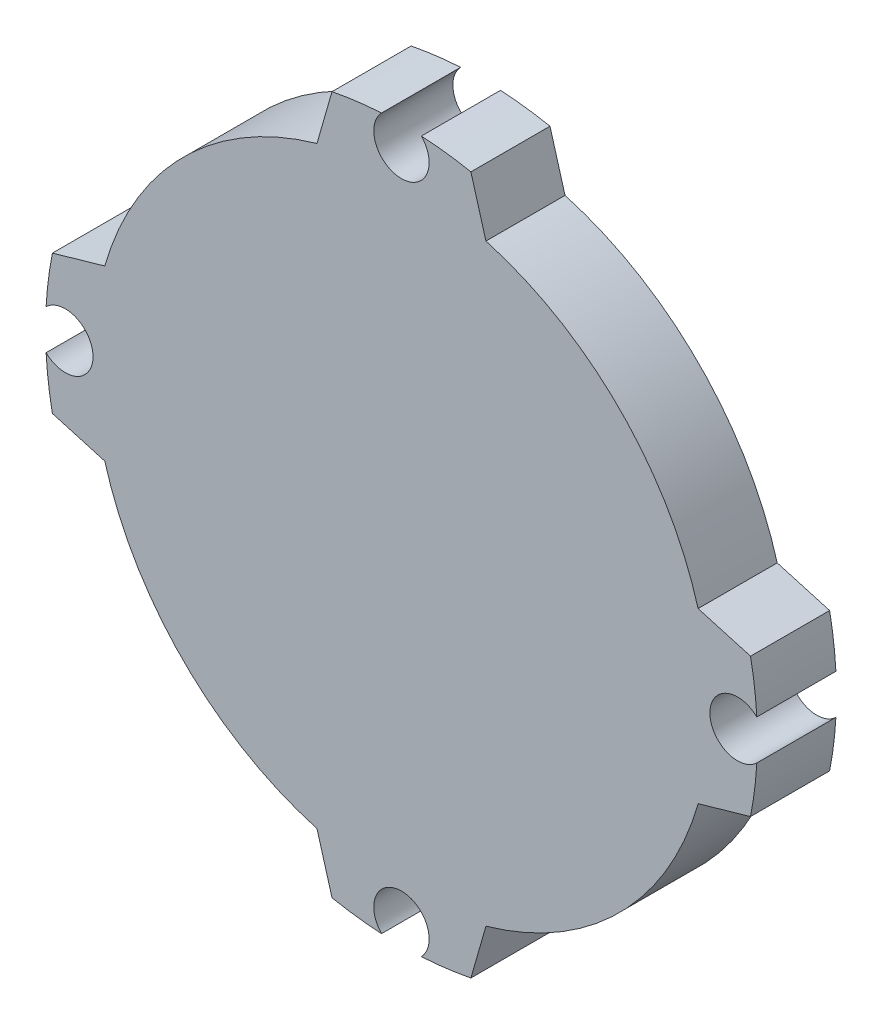
ISO-10303-21;
HEADER;
FILE_DESCRIPTION(('STEP AP214'),'2;1');
FILE_NAME('part.step','',(''),(''),'','','');
FILE_SCHEMA(('AUTOMOTIVE_DESIGN { 1 0 10303 214 1 1 1 1 }'));
ENDSEC;
DATA;
#1=APPLICATION_CONTEXT('core data for automotive mechanical design processes');
#2=APPLICATION_PROTOCOL_DEFINITION('international standard','automotive_design',2000,#1);
#3=PRODUCT_CONTEXT('',#1,'mechanical');
#4=PRODUCT('Part','Part','',(#3));
#5=PRODUCT_RELATED_PRODUCT_CATEGORY('part','',(#4));
#6=PRODUCT_DEFINITION_FORMATION('','',#4);
#7=PRODUCT_DEFINITION_CONTEXT('part definition',#1,'design');
#8=PRODUCT_DEFINITION('design','',#6,#7);
#9=PRODUCT_DEFINITION_SHAPE('','',#8);
#10=(LENGTH_UNIT() NAMED_UNIT(*) SI_UNIT(.MILLI.,.METRE.));
#11=(NAMED_UNIT(*) PLANE_ANGLE_UNIT() SI_UNIT($,.RADIAN.));
#12=(NAMED_UNIT(*) SI_UNIT($,.STERADIAN.) SOLID_ANGLE_UNIT());
#13=UNCERTAINTY_MEASURE_WITH_UNIT(LENGTH_MEASURE(1.E-05),#10,'distance_accuracy_value','');
#14=(GEOMETRIC_REPRESENTATION_CONTEXT(3) GLOBAL_UNCERTAINTY_ASSIGNED_CONTEXT((#13)) GLOBAL_UNIT_ASSIGNED_CONTEXT((#10,
#11,#12)) REPRESENTATION_CONTEXT('',''));
#15=CARTESIAN_POINT('',(0.,0.,0.));
#16=DIRECTION('',(0.,0.,1.));
#17=DIRECTION('',(1.,0.,0.));
#18=AXIS2_PLACEMENT_3D('',#15,#16,#17);
#19=CARTESIAN_POINT('',(8.60270960058673,31.4947345789204,4.));
#20=DIRECTION('',(0.,0.,-1.));
#21=DIRECTION('',(-1.,0.,0.));
#22=AXIS2_PLACEMENT_3D('',#19,#20,#21);
#23=CYLINDRICAL_SURFACE('',#22,1.40000000000075);
#24=CARTESIAN_POINT('',(8.60270960058673,31.4947345789204,0.));
#25=DIRECTION('',(0.,0.,1.));
#26=DIRECTION('',(1.,0.,0.));
#27=AXIS2_PLACEMENT_3D('',#24,#25,#26);
#28=CIRCLE('',#27,1.40000000000075);
#29=CARTESIAN_POINT('',(9.57447430646903,32.5025407886669,0.));
#30=VERTEX_POINT('',#29);
#31=CARTESIAN_POINT('',(9.57447430646899,30.4869283691739,0.));
#32=VERTEX_POINT('',#31);
#33=EDGE_CURVE('E227',#30,#32,#28,.T.);
#34=ORIENTED_EDGE('',*,*,#33,.F.);
#35=DIRECTION('',(0.,0.,-1.));
#36=VECTOR('',#35,1.);
#37=CARTESIAN_POINT('',(9.57447430646903,32.5025407886669,4.));
#38=LINE('',#37,#36);
#39=CARTESIAN_POINT('',(9.57447430646903,32.5025407886669,4.));
#40=VERTEX_POINT('',#39);
#41=EDGE_CURVE('E11',#40,#30,#38,.T.);
#42=ORIENTED_EDGE('',*,*,#41,.F.);
#43=CARTESIAN_POINT('',(8.60270960058673,31.4947345789204,4.));
#44=DIRECTION('',(0.,0.,1.));
#45=DIRECTION('',(1.,0.,0.));
#46=AXIS2_PLACEMENT_3D('',#43,#44,#45);
#47=CIRCLE('',#46,1.40000000000075);
#48=CARTESIAN_POINT('',(9.57447430646899,30.4869283691739,4.));
#49=VERTEX_POINT('',#48);
#50=EDGE_CURVE('E393',#40,#49,#47,.T.);
#51=ORIENTED_EDGE('',*,*,#50,.T.);
#52=DIRECTION('',(0.,0.,-1.));
#53=VECTOR('',#52,1.);
#54=CARTESIAN_POINT('',(9.57447430646899,30.4869283691739,4.));
#55=LINE('',#54,#53);
#56=EDGE_CURVE('E133',#49,#32,#55,.T.);
#57=ORIENTED_EDGE('',*,*,#56,.T.);
#58=EDGE_LOOP('',(#34,#42,#51,#57));
#59=FACE_BOUND('',#58,.T.);
#60=ADVANCED_FACE('F35',(#59),#23,.F.);
#61=CARTESIAN_POINT('',(-8.39729039941328,31.4947345789208,4.));
#62=DIRECTION('',(0.,0.,-1.));
#63=DIRECTION('',(-1.,0.,0.));
#64=AXIS2_PLACEMENT_3D('',#61,#62,#63);
#65=CYLINDRICAL_SURFACE('',#64,18.);
#66=CARTESIAN_POINT('',(-8.39729039941328,31.4947345789208,0.));
#67=DIRECTION('',(0.,0.,1.));
#68=DIRECTION('',(1.,0.,0.));
#69=AXIS2_PLACEMENT_3D('',#66,#67,#68);
#70=CIRCLE('',#69,18.);
#71=CARTESIAN_POINT('',(9.25671878014972,35.0069930955886,0.));
#72=VERTEX_POINT('',#71);
#73=EDGE_CURVE('E230',#30,#72,#70,.T.);
#74=ORIENTED_EDGE('',*,*,#73,.T.);
#75=DIRECTION('',(0.,0.,-1.));
#76=VECTOR('',#75,1.);
#77=CARTESIAN_POINT('',(9.25671878014972,35.0069930955886,4.));
#78=LINE('',#77,#76);
#79=CARTESIAN_POINT('',(9.25671878014972,35.0069930955886,4.));
#80=VERTEX_POINT('',#79);
#81=EDGE_CURVE('E43',#80,#72,#78,.T.);
#82=ORIENTED_EDGE('',*,*,#81,.F.);
#83=CARTESIAN_POINT('',(-8.39729039941328,31.4947345789208,4.));
#84=DIRECTION('',(0.,0.,1.));
#85=DIRECTION('',(1.,0.,0.));
#86=AXIS2_PLACEMENT_3D('',#83,#84,#85);
#87=CIRCLE('',#86,18.);
#88=EDGE_CURVE('E224',#40,#80,#87,.T.);
#89=ORIENTED_EDGE('',*,*,#88,.F.);
#90=ORIENTED_EDGE('',*,*,#41,.T.);
#91=EDGE_LOOP('',(#74,#82,#89,#90));
#92=FACE_BOUND('',#91,.T.);
#93=ADVANCED_FACE('F453',(#92),#65,.T.);
#94=CARTESIAN_POINT('',(9.98547614567223,34.7978714167868,4.));
#95=DIRECTION('',(-0.275824877161817,-0.961207905262264,0.));
#96=DIRECTION('',(0.961207905262264,-0.275824877161817,0.));
#97=AXIS2_PLACEMENT_3D('',#94,#95,#96);
#98=PLANE('',#97);
#99=DIRECTION('',(-0.961207905262264,0.275824877161817,0.));
#100=VECTOR('',#99,1.);
#101=CARTESIAN_POINT('',(9.98547614567223,34.7978714167868,0.));
#102=LINE('',#101,#100);
#103=CARTESIAN_POINT('',(6.60613088843301,35.7675965775584,0.));
#104=VERTEX_POINT('',#103);
#105=EDGE_CURVE('E232',#72,#104,#102,.T.);
#106=ORIENTED_EDGE('',*,*,#105,.T.);
#107=DIRECTION('',(0.,0.,-1.));
#108=VECTOR('',#107,1.);
#109=CARTESIAN_POINT('',(6.60613088843301,35.7675965775584,4.));
#110=LINE('',#109,#108);
#111=CARTESIAN_POINT('',(6.60613088843301,35.7675965775584,4.));
#112=VERTEX_POINT('',#111);
#113=EDGE_CURVE('E319',#112,#104,#110,.T.);
#114=ORIENTED_EDGE('',*,*,#113,.F.);
#115=DIRECTION('',(-0.961207905262264,0.275824877161817,0.));
#116=VECTOR('',#115,1.);
#117=CARTESIAN_POINT('',(9.98547614567223,34.7978714167868,4.));
#118=LINE('',#117,#116);
#119=EDGE_CURVE('E328',#80,#112,#118,.T.);
#120=ORIENTED_EDGE('',*,*,#119,.F.);
#121=ORIENTED_EDGE('',*,*,#81,.T.);
#122=EDGE_LOOP('',(#106,#114,#120,#121));
#123=FACE_BOUND('',#122,.T.);
#124=ADVANCED_FACE('F326',(#123),#98,.F.);
#125=CARTESIAN_POINT('',(-8.39729039941328,31.4947345789208,4.));
#126=DIRECTION('',(0.,0.,-1.));
#127=DIRECTION('',(-1.,0.,0.));
#128=AXIS2_PLACEMENT_3D('',#125,#126,#127);
#129=CYLINDRICAL_SURFACE('',#128,15.6);
#130=CARTESIAN_POINT('',(-8.39729039941328,31.4947345789208,0.));
#131=DIRECTION('',(0.,0.,1.));
#132=DIRECTION('',(1.,0.,0.));
#133=AXIS2_PLACEMENT_3D('',#130,#131,#132);
#134=CIRCLE('',#133,15.6);
#135=CARTESIAN_POINT('',(-4.12442840077335,46.4981558667664,0.));
#136=VERTEX_POINT('',#135);
#137=EDGE_CURVE('E236',#104,#136,#134,.T.);
#138=ORIENTED_EDGE('',*,*,#137,.T.);
#139=DIRECTION('',(0.,0.,-1.));
#140=VECTOR('',#139,1.);
#141=CARTESIAN_POINT('',(-4.12442840077335,46.4981558667664,4.));
#142=LINE('',#141,#140);
#143=CARTESIAN_POINT('',(-4.12442840077335,46.4981558667664,4.));
#144=VERTEX_POINT('',#143);
#145=EDGE_CURVE('E317',#144,#136,#142,.T.);
#146=ORIENTED_EDGE('',*,*,#145,.F.);
#147=CARTESIAN_POINT('',(-8.39729039941328,31.4947345789208,4.));
#148=DIRECTION('',(0.,0.,1.));
#149=DIRECTION('',(1.,0.,0.));
#150=AXIS2_PLACEMENT_3D('',#147,#148,#149);
#151=CIRCLE('',#150,15.6);
#152=EDGE_CURVE('E341',#112,#144,#151,.T.);
#153=ORIENTED_EDGE('',*,*,#152,.F.);
#154=ORIENTED_EDGE('',*,*,#113,.T.);
#155=EDGE_LOOP('',(#138,#146,#153,#154));
#156=FACE_BOUND('',#155,.T.);
#157=ADVANCED_FACE('F338',(#156),#129,.T.);
#158=CARTESIAN_POINT('',(8.51718149462446,2.44406077671683,4.));
#159=DIRECTION('',(0.961207905262203,0.275824877162029,0.));
#160=DIRECTION('',(-0.275824877162029,0.961207905262203,0.));
#161=AXIS2_PLACEMENT_3D('',#158,#159,#160);
#162=PLANE('',#161);
#163=DIRECTION('',(0.275824877162029,-0.961207905262203,0.));
#164=VECTOR('',#163,1.);
#165=CARTESIAN_POINT('',(8.51718149462446,2.44406077671683,0.));
#166=LINE('',#165,#164);
#167=CARTESIAN_POINT('',(-4.88503188274386,49.1487437584834,0.));
#168=VERTEX_POINT('',#167);
#169=EDGE_CURVE('E239',#168,#136,#166,.T.);
#170=ORIENTED_EDGE('',*,*,#169,.F.);
#171=DIRECTION('',(0.,0.,-1.));
#172=VECTOR('',#171,1.);
#173=CARTESIAN_POINT('',(-4.88503188274386,49.1487437584834,4.));
#174=LINE('',#173,#172);
#175=CARTESIAN_POINT('',(-4.88503188274386,49.1487437584834,4.));
#176=VERTEX_POINT('',#175);
#177=EDGE_CURVE('E315',#176,#168,#174,.T.);
#178=ORIENTED_EDGE('',*,*,#177,.F.);
#179=DIRECTION('',(0.275824877162029,-0.961207905262203,0.));
#180=VECTOR('',#179,1.);
#181=CARTESIAN_POINT('',(8.51718149462446,2.44406077671683,4.));
#182=LINE('',#181,#180);
#183=EDGE_CURVE('E343',#176,#144,#182,.T.);
#184=ORIENTED_EDGE('',*,*,#183,.T.);
#185=ORIENTED_EDGE('',*,*,#145,.T.);
#186=EDGE_LOOP('',(#170,#178,#184,#185));
#187=FACE_BOUND('',#186,.T.);
#188=ADVANCED_FACE('F465',(#187),#162,.T.);
#189=CARTESIAN_POINT('',(-7.38948418966819,49.4664992848031,0.));
#190=VERTEX_POINT('',#189);
#191=EDGE_CURVE('E234',#168,#190,#70,.T.);
#192=ORIENTED_EDGE('',*,*,#191,.T.);
#193=DIRECTION('',(0.,0.,-1.));
#194=VECTOR('',#193,1.);
#195=CARTESIAN_POINT('',(-7.38948418966819,49.4664992848031,4.));
#196=LINE('',#195,#194);
#197=CARTESIAN_POINT('',(-7.38948418966819,49.4664992848031,4.));
#198=VERTEX_POINT('',#197);
#199=EDGE_CURVE('E313',#198,#190,#196,.T.);
#200=ORIENTED_EDGE('',*,*,#199,.F.);
#201=EDGE_CURVE('E345',#176,#198,#87,.T.);
#202=ORIENTED_EDGE('',*,*,#201,.F.);
#203=ORIENTED_EDGE('',*,*,#177,.T.);
#204=EDGE_LOOP('',(#192,#200,#202,#203));
#205=FACE_BOUND('',#204,.T.);
#206=ADVANCED_FACE('F408',(#205),#65,.T.);
#207=CARTESIAN_POINT('',(-8.39729039941181,48.49473457892,4.));
#208=DIRECTION('',(0.,0.,-1.));
#209=DIRECTION('',(-1.,0.,0.));
#210=AXIS2_PLACEMENT_3D('',#207,#208,#209);
#211=CYLINDRICAL_SURFACE('',#210,1.39999999999925);
#212=CARTESIAN_POINT('',(-8.39729039941181,48.49473457892,0.));
#213=DIRECTION('',(0.,0.,1.));
#214=DIRECTION('',(1.,0.,0.));
#215=AXIS2_PLACEMENT_3D('',#212,#213,#214);
#216=CIRCLE('',#215,1.39999999999925);
#217=CARTESIAN_POINT('',(-9.40509660915526,49.4664992848033,0.));
#218=VERTEX_POINT('',#217);
#219=EDGE_CURVE('E242',#218,#190,#216,.T.);
#220=ORIENTED_EDGE('',*,*,#219,.F.);
#221=DIRECTION('',(0.,0.,-1.));
#222=VECTOR('',#221,1.);
#223=CARTESIAN_POINT('',(-9.40509660915526,49.4664992848033,4.));
#224=LINE('',#223,#222);
#225=CARTESIAN_POINT('',(-9.40509660915526,49.4664992848033,4.));
#226=VERTEX_POINT('',#225);
#227=EDGE_CURVE('E311',#226,#218,#224,.T.);
#228=ORIENTED_EDGE('',*,*,#227,.F.);
#229=CARTESIAN_POINT('',(-8.39729039941181,48.49473457892,4.));
#230=DIRECTION('',(0.,0.,1.));
#231=DIRECTION('',(1.,0.,0.));
#232=AXIS2_PLACEMENT_3D('',#229,#230,#231);
#233=CIRCLE('',#232,1.39999999999925);
#234=EDGE_CURVE('E349',#226,#198,#233,.T.);
#235=ORIENTED_EDGE('',*,*,#234,.T.);
#236=ORIENTED_EDGE('',*,*,#199,.T.);
#237=EDGE_LOOP('',(#220,#228,#235,#236));
#238=FACE_BOUND('',#237,.T.);
#239=ADVANCED_FACE('F412',(#238),#211,.F.);
#240=CARTESIAN_POINT('',(-11.9095489160811,49.1487437584838,0.));
#241=VERTEX_POINT('',#240);
#242=EDGE_CURVE('E245',#218,#241,#70,.T.);
#243=ORIENTED_EDGE('',*,*,#242,.T.);
#244=DIRECTION('',(0.,0.,-1.));
#245=VECTOR('',#244,1.);
#246=CARTESIAN_POINT('',(-11.9095489160811,49.1487437584838,4.));
#247=LINE('',#246,#245);
#248=CARTESIAN_POINT('',(-11.9095489160811,49.1487437584838,4.));
#249=VERTEX_POINT('',#248);
#250=EDGE_CURVE('E308',#249,#241,#247,.T.);
#251=ORIENTED_EDGE('',*,*,#250,.F.);
#252=EDGE_CURVE('E352',#226,#249,#87,.T.);
#253=ORIENTED_EDGE('',*,*,#252,.F.);
#254=ORIENTED_EDGE('',*,*,#227,.T.);
#255=EDGE_LOOP('',(#243,#251,#253,#254));
#256=FACE_BOUND('',#255,.T.);
#257=ADVANCED_FACE('F413',(#256),#65,.T.);
#258=CARTESIAN_POINT('',(-24.0340412867421,6.89672489096827,4.));
#259=DIRECTION('',(0.961207905262263,-0.275824877161819,0.));
#260=DIRECTION('',(0.275824877161819,0.961207905262263,0.));
#261=AXIS2_PLACEMENT_3D('',#258,#259,#260);
#262=PLANE('',#261);
#263=DIRECTION('',(-0.275824877161819,-0.961207905262263,0.));
#264=VECTOR('',#263,1.);
#265=CARTESIAN_POINT('',(-24.0340412867421,6.89672489096827,0.));
#266=LINE('',#265,#264);
#267=CARTESIAN_POINT('',(-12.6701523980509,46.4981558667671,0.));
#268=VERTEX_POINT('',#267);
#269=EDGE_CURVE('E246',#241,#268,#266,.T.);
#270=ORIENTED_EDGE('',*,*,#269,.T.);
#271=DIRECTION('',(0.,0.,-1.));
#272=VECTOR('',#271,1.);
#273=CARTESIAN_POINT('',(-12.6701523980509,46.4981558667671,4.));
#274=LINE('',#273,#272);
#275=CARTESIAN_POINT('',(-12.6701523980509,46.4981558667671,4.));
#276=VERTEX_POINT('',#275);
#277=EDGE_CURVE('E305',#276,#268,#274,.T.);
#278=ORIENTED_EDGE('',*,*,#277,.F.);
#279=DIRECTION('',(-0.275824877161819,-0.961207905262263,0.));
#280=VECTOR('',#279,1.);
#281=CARTESIAN_POINT('',(-24.0340412867421,6.89672489096827,4.));
#282=LINE('',#281,#280);
#283=EDGE_CURVE('E353',#249,#276,#282,.T.);
#284=ORIENTED_EDGE('',*,*,#283,.F.);
#285=ORIENTED_EDGE('',*,*,#250,.T.);
#286=EDGE_LOOP('',(#270,#278,#284,#285));
#287=FACE_BOUND('',#286,.T.);
#288=ADVANCED_FACE('F417',(#287),#262,.F.);
#289=CARTESIAN_POINT('',(-8.39729039941328,31.4947345789208,4.));
#290=DIRECTION('',(0.,0.,-1.));
#291=DIRECTION('',(-1.,0.,0.));
#292=AXIS2_PLACEMENT_3D('',#289,#290,#291);
#293=CYLINDRICAL_SURFACE('',#292,15.6);
#294=CARTESIAN_POINT('',(-8.39729039941328,31.4947345789208,0.));
#295=DIRECTION('',(0.,0.,1.));
#296=DIRECTION('',(1.,0.,0.));
#297=AXIS2_PLACEMENT_3D('',#294,#295,#296);
#298=CIRCLE('',#297,15.6);
#299=CARTESIAN_POINT('',(-23.4007116872589,35.7675965775607,0.));
#300=VERTEX_POINT('',#299);
#301=EDGE_CURVE('E248',#268,#300,#298,.T.);
#302=ORIENTED_EDGE('',*,*,#301,.T.);
#303=DIRECTION('',(0.,0.,-1.));
#304=VECTOR('',#303,1.);
#305=CARTESIAN_POINT('',(-23.4007116872589,35.7675965775607,4.));
#306=LINE('',#305,#304);
#307=CARTESIAN_POINT('',(-23.4007116872589,35.7675965775607,4.));
#308=VERTEX_POINT('',#307);
#309=EDGE_CURVE('E303',#308,#300,#306,.T.);
#310=ORIENTED_EDGE('',*,*,#309,.F.);
#311=CARTESIAN_POINT('',(-8.39729039941328,31.4947345789208,4.));
#312=DIRECTION('',(0.,0.,1.));
#313=DIRECTION('',(1.,0.,0.));
#314=AXIS2_PLACEMENT_3D('',#311,#312,#313);
#315=CIRCLE('',#314,15.6);
#316=EDGE_CURVE('E355',#276,#308,#315,.T.);
#317=ORIENTED_EDGE('',*,*,#316,.F.);
#318=ORIENTED_EDGE('',*,*,#277,.T.);
#319=EDGE_LOOP('',(#302,#310,#317,#318));
#320=FACE_BOUND('',#319,.T.);
#321=ADVANCED_FACE('F421',(#320),#293,.T.);
#322=CARTESIAN_POINT('',(-11.2631971523802,39.2505355310455,4.));
#323=DIRECTION('',(-0.27582487716203,0.961207905262202,0.));
#324=DIRECTION('',(-0.961207905262202,-0.27582487716203,0.));
#325=AXIS2_PLACEMENT_3D('',#322,#323,#324);
#326=PLANE('',#325);
#327=DIRECTION('',(0.961207905262202,0.27582487716203,0.));
#328=VECTOR('',#327,1.);
#329=CARTESIAN_POINT('',(-11.2631971523802,39.2505355310455,0.));
#330=LINE('',#329,#328);
#331=CARTESIAN_POINT('',(-26.051299578976,35.0069930955902,0.));
#332=VERTEX_POINT('',#331);
#333=EDGE_CURVE('E251',#332,#300,#330,.T.);
#334=ORIENTED_EDGE('',*,*,#333,.F.);
#335=DIRECTION('',(0.,0.,-1.));
#336=VECTOR('',#335,1.);
#337=CARTESIAN_POINT('',(-26.051299578976,35.0069930955902,4.));
#338=LINE('',#337,#336);
#339=CARTESIAN_POINT('',(-26.051299578976,35.0069930955902,4.));
#340=VERTEX_POINT('',#339);
#341=EDGE_CURVE('E301',#340,#332,#338,.T.);
#342=ORIENTED_EDGE('',*,*,#341,.F.);
#343=DIRECTION('',(0.961207905262202,0.27582487716203,0.));
#344=VECTOR('',#343,1.);
#345=CARTESIAN_POINT('',(-11.2631971523802,39.2505355310455,4.));
#346=LINE('',#345,#344);
#347=EDGE_CURVE('E357',#340,#308,#346,.T.);
#348=ORIENTED_EDGE('',*,*,#347,.T.);
#349=ORIENTED_EDGE('',*,*,#309,.T.);
#350=EDGE_LOOP('',(#334,#342,#348,#349));
#351=FACE_BOUND('',#350,.T.);
#352=ADVANCED_FACE('F425',(#351),#326,.T.);
#353=CARTESIAN_POINT('',(-26.3690551052957,32.502540788665,0.));
#354=VERTEX_POINT('',#353);
#355=EDGE_CURVE('E254',#332,#354,#70,.T.);
#356=ORIENTED_EDGE('',*,*,#355,.T.);
#357=DIRECTION('',(0.,0.,-1.));
#358=VECTOR('',#357,1.);
#359=CARTESIAN_POINT('',(-26.3690551052957,32.502540788665,4.));
#360=LINE('',#359,#358);
#361=CARTESIAN_POINT('',(-26.3690551052957,32.502540788665,4.));
#362=VERTEX_POINT('',#361);
#363=EDGE_CURVE('E299',#362,#354,#360,.T.);
#364=ORIENTED_EDGE('',*,*,#363,.F.);
#365=EDGE_CURVE('E360',#340,#362,#87,.T.);
#366=ORIENTED_EDGE('',*,*,#365,.F.);
#367=ORIENTED_EDGE('',*,*,#341,.T.);
#368=EDGE_LOOP('',(#356,#364,#366,#367));
#369=FACE_BOUND('',#368,.T.);
#370=ADVANCED_FACE('F426',(#369),#65,.T.);
#371=CARTESIAN_POINT('',(-25.3972903994125,31.4947345789204,4.));
#372=DIRECTION('',(0.,0.,-1.));
#373=DIRECTION('',(-1.,0.,0.));
#374=AXIS2_PLACEMENT_3D('',#371,#372,#373);
#375=CYLINDRICAL_SURFACE('',#374,1.4);
#376=CARTESIAN_POINT('',(-25.3972903994125,31.4947345789204,0.));
#377=DIRECTION('',(0.,0.,1.));
#378=DIRECTION('',(1.,0.,0.));
#379=AXIS2_PLACEMENT_3D('',#376,#377,#378);
#380=CIRCLE('',#379,1.4);
#381=CARTESIAN_POINT('',(-26.3690551052957,30.4869283691758,0.));
#382=VERTEX_POINT('',#381);
#383=EDGE_CURVE('E255',#382,#354,#380,.T.);
#384=ORIENTED_EDGE('',*,*,#383,.F.);
#385=DIRECTION('',(0.,0.,-1.));
#386=VECTOR('',#385,1.);
#387=CARTESIAN_POINT('',(-26.3690551052957,30.4869283691758,4.));
#388=LINE('',#387,#386);
#389=CARTESIAN_POINT('',(-26.3690551052957,30.4869283691758,4.));
#390=VERTEX_POINT('',#389);
#391=EDGE_CURVE('E297',#390,#382,#388,.T.);
#392=ORIENTED_EDGE('',*,*,#391,.F.);
#393=CARTESIAN_POINT('',(-25.3972903994125,31.4947345789204,4.));
#394=DIRECTION('',(0.,0.,1.));
#395=DIRECTION('',(1.,0.,0.));
#396=AXIS2_PLACEMENT_3D('',#393,#394,#395);
#397=CIRCLE('',#396,1.4);
#398=EDGE_CURVE('E361',#390,#362,#397,.T.);
#399=ORIENTED_EDGE('',*,*,#398,.T.);
#400=ORIENTED_EDGE('',*,*,#363,.T.);
#401=EDGE_LOOP('',(#384,#392,#399,#400));
#402=FACE_BOUND('',#401,.T.);
#403=ADVANCED_FACE('F429',(#402),#375,.F.);
#404=CARTESIAN_POINT('',(-26.0512995789764,27.9824760622534,0.));
#405=VERTEX_POINT('',#404);
#406=EDGE_CURVE('E258',#382,#405,#70,.T.);
#407=ORIENTED_EDGE('',*,*,#406,.T.);
#408=DIRECTION('',(0.,0.,-1.));
#409=VECTOR('',#408,1.);
#410=CARTESIAN_POINT('',(-26.0512995789764,27.9824760622534,4.));
#411=LINE('',#410,#409);
#412=CARTESIAN_POINT('',(-26.0512995789764,27.9824760622534,4.));
#413=VERTEX_POINT('',#412);
#414=EDGE_CURVE('E294',#413,#405,#411,.T.);
#415=ORIENTED_EDGE('',*,*,#414,.F.);
#416=EDGE_CURVE('E364',#390,#413,#87,.T.);
#417=ORIENTED_EDGE('',*,*,#416,.F.);
#418=ORIENTED_EDGE('',*,*,#391,.T.);
#419=EDGE_LOOP('',(#407,#415,#417,#418));
#420=FACE_BOUND('',#419,.T.);
#421=ADVANCED_FACE('F430',(#420),#65,.T.);
#422=CARTESIAN_POINT('',(5.43688915849595,18.9467349462916,4.));
#423=DIRECTION('',(0.275824877161945,0.961207905262227,0.));
#424=DIRECTION('',(-0.961207905262227,0.275824877161945,0.));
#425=AXIS2_PLACEMENT_3D('',#422,#423,#424);
#426=PLANE('',#425);
#427=DIRECTION('',(0.961207905262227,-0.275824877161945,0.));
#428=VECTOR('',#427,1.);
#429=CARTESIAN_POINT('',(5.43688915849595,18.9467349462916,0.));
#430=LINE('',#429,#428);
#431=CARTESIAN_POINT('',(-23.4007116872595,27.2218725802832,0.));
#432=VERTEX_POINT('',#431);
#433=EDGE_CURVE('E259',#405,#432,#430,.T.);
#434=ORIENTED_EDGE('',*,*,#433,.T.);
#435=DIRECTION('',(0.,0.,-1.));
#436=VECTOR('',#435,1.);
#437=CARTESIAN_POINT('',(-23.4007116872595,27.2218725802832,4.));
#438=LINE('',#437,#436);
#439=CARTESIAN_POINT('',(-23.4007116872595,27.2218725802832,4.));
#440=VERTEX_POINT('',#439);
#441=EDGE_CURVE('E291',#440,#432,#438,.T.);
#442=ORIENTED_EDGE('',*,*,#441,.F.);
#443=DIRECTION('',(0.961207905262227,-0.275824877161945,0.));
#444=VECTOR('',#443,1.);
#445=CARTESIAN_POINT('',(5.43688915849595,18.9467349462916,4.));
#446=LINE('',#445,#444);
#447=EDGE_CURVE('E365',#413,#440,#446,.T.);
#448=ORIENTED_EDGE('',*,*,#447,.F.);
#449=ORIENTED_EDGE('',*,*,#414,.T.);
#450=EDGE_LOOP('',(#434,#442,#448,#449));
#451=FACE_BOUND('',#450,.T.);
#452=ADVANCED_FACE('F435',(#451),#426,.F.);
#453=CARTESIAN_POINT('',(-8.39729039941328,31.4947345789208,4.));
#454=DIRECTION('',(0.,0.,-1.));
#455=DIRECTION('',(-1.,0.,0.));
#456=AXIS2_PLACEMENT_3D('',#453,#454,#455);
#457=CYLINDRICAL_SURFACE('',#456,15.6);
#458=CARTESIAN_POINT('',(-8.39729039941328,31.4947345789208,0.));
#459=DIRECTION('',(0.,0.,1.));
#460=DIRECTION('',(1.,0.,0.));
#461=AXIS2_PLACEMENT_3D('',#458,#459,#460);
#462=CIRCLE('',#461,15.6);
#463=CARTESIAN_POINT('',(-12.6701523980532,16.4913132910752,0.));
#464=VERTEX_POINT('',#463);
#465=EDGE_CURVE('E261',#432,#464,#462,.T.);
#466=ORIENTED_EDGE('',*,*,#465,.T.);
#467=DIRECTION('',(0.,0.,-1.));
#468=VECTOR('',#467,1.);
#469=CARTESIAN_POINT('',(-12.6701523980532,16.4913132910752,4.));
#470=LINE('',#469,#468);
#471=CARTESIAN_POINT('',(-12.6701523980532,16.4913132910752,4.));
#472=VERTEX_POINT('',#471);
#473=EDGE_CURVE('E289',#472,#464,#470,.T.);
#474=ORIENTED_EDGE('',*,*,#473,.F.);
#475=CARTESIAN_POINT('',(-8.39729039941328,31.4947345789208,4.));
#476=DIRECTION('',(0.,0.,1.));
#477=DIRECTION('',(1.,0.,0.));
#478=AXIS2_PLACEMENT_3D('',#475,#476,#477);
#479=CIRCLE('',#478,15.6);
#480=EDGE_CURVE('E367',#440,#472,#479,.T.);
#481=ORIENTED_EDGE('',*,*,#480,.F.);
#482=ORIENTED_EDGE('',*,*,#441,.T.);
#483=EDGE_LOOP('',(#466,#474,#481,#482));
#484=FACE_BOUND('',#483,.T.);
#485=ADVANCED_FACE('F439',(#484),#457,.T.);
#486=CARTESIAN_POINT('',(-7.33395497587473,-2.10452621046713,4.));
#487=DIRECTION('',(-0.961207905262202,-0.275824877162031,0.));
#488=DIRECTION('',(0.275824877162031,-0.961207905262202,0.));
#489=AXIS2_PLACEMENT_3D('',#486,#487,#488);
#490=PLANE('',#489);
#491=DIRECTION('',(-0.275824877162031,0.961207905262202,0.));
#492=VECTOR('',#491,1.);
#493=CARTESIAN_POINT('',(-7.33395497587473,-2.10452621046713,0.));
#494=LINE('',#493,#492);
#495=CARTESIAN_POINT('',(-11.9095489160827,13.8407253993581,0.));
#496=VERTEX_POINT('',#495);
#497=EDGE_CURVE('E264',#496,#464,#494,.T.);
#498=ORIENTED_EDGE('',*,*,#497,.F.);
#499=DIRECTION('',(0.,0.,-1.));
#500=VECTOR('',#499,1.);
#501=CARTESIAN_POINT('',(-11.9095489160827,13.8407253993581,4.));
#502=LINE('',#501,#500);
#503=CARTESIAN_POINT('',(-11.9095489160827,13.8407253993581,4.));
#504=VERTEX_POINT('',#503);
#505=EDGE_CURVE('E287',#504,#496,#502,.T.);
#506=ORIENTED_EDGE('',*,*,#505,.F.);
#507=DIRECTION('',(-0.275824877162031,0.961207905262202,0.));
#508=VECTOR('',#507,1.);
#509=CARTESIAN_POINT('',(-7.33395497587473,-2.10452621046713,4.));
#510=LINE('',#509,#508);
#511=EDGE_CURVE('E369',#504,#472,#510,.T.);
#512=ORIENTED_EDGE('',*,*,#511,.T.);
#513=ORIENTED_EDGE('',*,*,#473,.T.);
#514=EDGE_LOOP('',(#498,#506,#512,#513));
#515=FACE_BOUND('',#514,.T.);
#516=ADVANCED_FACE('F443',(#515),#490,.T.);
#517=CARTESIAN_POINT('',(-9.40509660915821,13.5229698730384,0.));
#518=VERTEX_POINT('',#517);
#519=EDGE_CURVE('E267',#496,#518,#70,.T.);
#520=ORIENTED_EDGE('',*,*,#519,.T.);
#521=DIRECTION('',(0.,0.,-1.));
#522=VECTOR('',#521,1.);
#523=CARTESIAN_POINT('',(-9.40509660915821,13.5229698730384,4.));
#524=LINE('',#523,#522);
#525=CARTESIAN_POINT('',(-9.40509660915821,13.5229698730384,4.));
#526=VERTEX_POINT('',#525);
#527=EDGE_CURVE('E285',#526,#518,#524,.T.);
#528=ORIENTED_EDGE('',*,*,#527,.F.);
#529=EDGE_CURVE('E372',#504,#526,#87,.T.);
#530=ORIENTED_EDGE('',*,*,#529,.F.);
#531=ORIENTED_EDGE('',*,*,#505,.T.);
#532=EDGE_LOOP('',(#520,#528,#530,#531));
#533=FACE_BOUND('',#532,.T.);
#534=ADVANCED_FACE('F444',(#533),#65,.T.);
#535=CARTESIAN_POINT('',(-8.39729039941249,14.4947345789204,4.));
#536=DIRECTION('',(0.,0.,-1.));
#537=DIRECTION('',(-1.,0.,0.));
#538=AXIS2_PLACEMENT_3D('',#535,#536,#537);
#539=CYLINDRICAL_SURFACE('',#538,1.4);
#540=CARTESIAN_POINT('',(-8.39729039941249,14.4947345789204,0.));
#541=DIRECTION('',(0.,0.,1.));
#542=DIRECTION('',(1.,0.,0.));
#543=AXIS2_PLACEMENT_3D('',#540,#541,#542);
#544=CIRCLE('',#543,1.4);
#545=CARTESIAN_POINT('',(-7.38948418966669,13.5229698730385,0.));
#546=VERTEX_POINT('',#545);
#547=EDGE_CURVE('E268',#546,#518,#544,.T.);
#548=ORIENTED_EDGE('',*,*,#547,.F.);
#549=DIRECTION('',(0.,0.,-1.));
#550=VECTOR('',#549,1.);
#551=CARTESIAN_POINT('',(-7.38948418966669,13.5229698730385,4.));
#552=LINE('',#551,#550);
#553=CARTESIAN_POINT('',(-7.38948418966669,13.5229698730385,4.));
#554=VERTEX_POINT('',#553);
#555=EDGE_CURVE('E283',#554,#546,#552,.T.);
#556=ORIENTED_EDGE('',*,*,#555,.F.);
#557=CARTESIAN_POINT('',(-8.39729039941249,14.4947345789204,4.));
#558=DIRECTION('',(0.,0.,1.));
#559=DIRECTION('',(1.,0.,0.));
#560=AXIS2_PLACEMENT_3D('',#557,#558,#559);
#561=CIRCLE('',#560,1.4);
#562=EDGE_CURVE('E373',#554,#526,#561,.T.);
#563=ORIENTED_EDGE('',*,*,#562,.T.);
#564=ORIENTED_EDGE('',*,*,#527,.T.);
#565=EDGE_LOOP('',(#548,#556,#563,#564));
#566=FACE_BOUND('',#565,.T.);
#567=ADVANCED_FACE('F447',(#566),#539,.F.);
#568=CARTESIAN_POINT('',(-4.88503188274549,13.8407253993578,0.));
#569=VERTEX_POINT('',#568);
#570=EDGE_CURVE('E271',#546,#569,#70,.T.);
#571=ORIENTED_EDGE('',*,*,#570,.T.);
#572=DIRECTION('',(0.,0.,-1.));
#573=VECTOR('',#572,1.);
#574=CARTESIAN_POINT('',(-4.88503188274549,13.8407253993578,4.));
#575=LINE('',#574,#573);
#576=CARTESIAN_POINT('',(-4.88503188274549,13.8407253993578,4.));
#577=VERTEX_POINT('',#576);
#578=EDGE_CURVE('E280',#577,#569,#575,.T.);
#579=ORIENTED_EDGE('',*,*,#578,.F.);
#580=EDGE_CURVE('E223',#554,#577,#87,.T.);
#581=ORIENTED_EDGE('',*,*,#580,.F.);
#582=ORIENTED_EDGE('',*,*,#555,.T.);
#583=EDGE_LOOP('',(#571,#579,#581,#582));
#584=FACE_BOUND('',#583,.T.);
#585=ADVANCED_FACE('F448',(#584),#65,.T.);
#586=CARTESIAN_POINT('',(-8.18290481625135,2.34813790379048,4.));
#587=DIRECTION('',(-0.961207905262263,0.275824877161817,0.));
#588=DIRECTION('',(-0.275824877161817,-0.961207905262263,0.));
#589=AXIS2_PLACEMENT_3D('',#586,#587,#588);
#590=PLANE('',#589);
#591=DIRECTION('',(0.275824877161817,0.961207905262263,0.));
#592=VECTOR('',#591,1.);
#593=CARTESIAN_POINT('',(-8.18290481625135,2.34813790379048,0.));
#594=LINE('',#593,#592);
#595=CARTESIAN_POINT('',(-4.1244284007757,16.4913132910745,0.));
#596=VERTEX_POINT('',#595);
#597=EDGE_CURVE('E272',#569,#596,#594,.T.);
#598=ORIENTED_EDGE('',*,*,#597,.T.);
#599=DIRECTION('',(0.,0.,-1.));
#600=VECTOR('',#599,1.);
#601=CARTESIAN_POINT('',(-4.1244284007757,16.4913132910745,4.));
#602=LINE('',#601,#600);
#603=CARTESIAN_POINT('',(-4.1244284007757,16.4913132910745,4.));
#604=VERTEX_POINT('',#603);
#605=EDGE_CURVE('E218',#604,#596,#602,.T.);
#606=ORIENTED_EDGE('',*,*,#605,.F.);
#607=DIRECTION('',(0.275824877161817,0.961207905262263,0.));
#608=VECTOR('',#607,1.);
#609=CARTESIAN_POINT('',(-8.18290481625135,2.34813790379048,4.));
#610=LINE('',#609,#608);
#611=EDGE_CURVE('E205',#577,#604,#610,.T.);
#612=ORIENTED_EDGE('',*,*,#611,.F.);
#613=ORIENTED_EDGE('',*,*,#578,.T.);
#614=EDGE_LOOP('',(#598,#606,#612,#613));
#615=FACE_BOUND('',#614,.T.);
#616=ADVANCED_FACE('F451',(#615),#590,.F.);
#617=CARTESIAN_POINT('',(-8.39729039941328,31.4947345789208,4.));
#618=DIRECTION('',(0.,0.,-1.));
#619=DIRECTION('',(-1.,0.,0.));
#620=AXIS2_PLACEMENT_3D('',#617,#618,#619);
#621=CYLINDRICAL_SURFACE('',#620,15.6);
#622=CARTESIAN_POINT('',(-8.39729039941328,31.4947345789208,0.));
#623=DIRECTION('',(0.,0.,1.));
#624=DIRECTION('',(1.,0.,0.));
#625=AXIS2_PLACEMENT_3D('',#622,#623,#624);
#626=CIRCLE('',#625,15.6);
#627=CARTESIAN_POINT('',(6.60613088843234,27.2218725802808,0.));
#628=VERTEX_POINT('',#627);
#629=EDGE_CURVE('E214',#596,#628,#626,.T.);
#630=ORIENTED_EDGE('',*,*,#629,.T.);
#631=DIRECTION('',(0.,0.,-1.));
#632=VECTOR('',#631,1.);
#633=CARTESIAN_POINT('',(6.60613088843234,27.2218725802808,4.));
#634=LINE('',#633,#632);
#635=CARTESIAN_POINT('',(6.60613088843234,27.2218725802808,4.));
#636=VERTEX_POINT('',#635);
#637=EDGE_CURVE('E211',#636,#628,#634,.T.);
#638=ORIENTED_EDGE('',*,*,#637,.F.);
#639=CARTESIAN_POINT('',(-8.39729039941328,31.4947345789208,4.));
#640=DIRECTION('',(0.,0.,1.));
#641=DIRECTION('',(1.,0.,0.));
#642=AXIS2_PLACEMENT_3D('',#639,#640,#641);
#643=CIRCLE('',#642,15.6);
#644=EDGE_CURVE('E199',#604,#636,#643,.T.);
#645=ORIENTED_EDGE('',*,*,#644,.F.);
#646=ORIENTED_EDGE('',*,*,#605,.T.);
#647=EDGE_LOOP('',(#630,#638,#645,#646));
#648=FACE_BOUND('',#647,.T.);
#649=ADVANCED_FACE('F212',(#648),#621,.T.);
#650=CARTESIAN_POINT('',(-6.71461016519616,23.3993990605463,4.));
#651=DIRECTION('',(0.27582487716203,-0.961207905262202,0.));
#652=DIRECTION('',(0.961207905262202,0.27582487716203,0.));
#653=AXIS2_PLACEMENT_3D('',#650,#651,#652);
#654=PLANE('',#653);
#655=DIRECTION('',(-0.961207905262202,-0.27582487716203,0.));
#656=VECTOR('',#655,1.);
#657=CARTESIAN_POINT('',(-6.71461016519616,23.3993990605463,0.));
#658=LINE('',#657,#656);
#659=CARTESIAN_POINT('',(9.2567187801494,27.9824760622514,0.));
#660=VERTEX_POINT('',#659);
#661=EDGE_CURVE('E275',#660,#628,#658,.T.);
#662=ORIENTED_EDGE('',*,*,#661,.F.);
#663=DIRECTION('',(0.,0.,-1.));
#664=VECTOR('',#663,1.);
#665=CARTESIAN_POINT('',(9.2567187801494,27.9824760622514,4.));
#666=LINE('',#665,#664);
#667=CARTESIAN_POINT('',(9.2567187801494,27.9824760622514,4.));
#668=VERTEX_POINT('',#667);
#669=EDGE_CURVE('E126',#668,#660,#666,.T.);
#670=ORIENTED_EDGE('',*,*,#669,.F.);
#671=DIRECTION('',(-0.961207905262202,-0.27582487716203,0.));
#672=VECTOR('',#671,1.);
#673=CARTESIAN_POINT('',(-6.71461016519616,23.3993990605463,4.));
#674=LINE('',#673,#672);
#675=EDGE_CURVE('E203',#668,#636,#674,.T.);
#676=ORIENTED_EDGE('',*,*,#675,.T.);
#677=ORIENTED_EDGE('',*,*,#637,.T.);
#678=EDGE_LOOP('',(#662,#670,#676,#677));
#679=FACE_BOUND('',#678,.T.);
#680=ADVANCED_FACE('F220',(#679),#654,.T.);
#681=EDGE_CURVE('E233',#660,#32,#70,.T.);
#682=ORIENTED_EDGE('',*,*,#681,.T.);
#683=ORIENTED_EDGE('',*,*,#56,.F.);
#684=EDGE_CURVE('E51',#668,#49,#87,.T.);
#685=ORIENTED_EDGE('',*,*,#684,.F.);
#686=ORIENTED_EDGE('',*,*,#669,.T.);
#687=EDGE_LOOP('',(#682,#683,#685,#686));
#688=FACE_BOUND('',#687,.T.);
#689=ADVANCED_FACE('F458',(#688),#65,.T.);
#690=CARTESIAN_POINT('',(0.,0.,4.));
#691=DIRECTION('',(0.,0.,1.));
#692=DIRECTION('',(1.,0.,0.));
#693=AXIS2_PLACEMENT_3D('',#690,#691,#692);
#694=PLANE('',#693);
#695=ORIENTED_EDGE('',*,*,#50,.F.);
#696=ORIENTED_EDGE('',*,*,#88,.T.);
#697=ORIENTED_EDGE('',*,*,#119,.T.);
#698=ORIENTED_EDGE('',*,*,#152,.T.);
#699=ORIENTED_EDGE('',*,*,#183,.F.);
#700=ORIENTED_EDGE('',*,*,#201,.T.);
#701=ORIENTED_EDGE('',*,*,#234,.F.);
#702=ORIENTED_EDGE('',*,*,#252,.T.);
#703=ORIENTED_EDGE('',*,*,#283,.T.);
#704=ORIENTED_EDGE('',*,*,#316,.T.);
#705=ORIENTED_EDGE('',*,*,#347,.F.);
#706=ORIENTED_EDGE('',*,*,#365,.T.);
#707=ORIENTED_EDGE('',*,*,#398,.F.);
#708=ORIENTED_EDGE('',*,*,#416,.T.);
#709=ORIENTED_EDGE('',*,*,#447,.T.);
#710=ORIENTED_EDGE('',*,*,#480,.T.);
#711=ORIENTED_EDGE('',*,*,#511,.F.);
#712=ORIENTED_EDGE('',*,*,#529,.T.);
#713=ORIENTED_EDGE('',*,*,#562,.F.);
#714=ORIENTED_EDGE('',*,*,#580,.T.);
#715=ORIENTED_EDGE('',*,*,#611,.T.);
#716=ORIENTED_EDGE('',*,*,#644,.T.);
#717=ORIENTED_EDGE('',*,*,#675,.F.);
#718=ORIENTED_EDGE('',*,*,#684,.T.);
#719=EDGE_LOOP('',(#695,#696,#697,#698,#699,#700,#701,#702,#703,#704,#705,#706,#707,#708,#709,
#710,#711,#712,#713,#714,#715,#716,#717,#718));
#720=FACE_BOUND('',#719,.T.);
#721=ADVANCED_FACE('F201',(#720),#694,.T.);
#722=CARTESIAN_POINT('',(0.,0.,0.));
#723=DIRECTION('',(0.,0.,1.));
#724=DIRECTION('',(1.,0.,0.));
#725=AXIS2_PLACEMENT_3D('',#722,#723,#724);
#726=PLANE('',#725);
#727=ORIENTED_EDGE('',*,*,#33,.T.);
#728=ORIENTED_EDGE('',*,*,#681,.F.);
#729=ORIENTED_EDGE('',*,*,#661,.T.);
#730=ORIENTED_EDGE('',*,*,#629,.F.);
#731=ORIENTED_EDGE('',*,*,#597,.F.);
#732=ORIENTED_EDGE('',*,*,#570,.F.);
#733=ORIENTED_EDGE('',*,*,#547,.T.);
#734=ORIENTED_EDGE('',*,*,#519,.F.);
#735=ORIENTED_EDGE('',*,*,#497,.T.);
#736=ORIENTED_EDGE('',*,*,#465,.F.);
#737=ORIENTED_EDGE('',*,*,#433,.F.);
#738=ORIENTED_EDGE('',*,*,#406,.F.);
#739=ORIENTED_EDGE('',*,*,#383,.T.);
#740=ORIENTED_EDGE('',*,*,#355,.F.);
#741=ORIENTED_EDGE('',*,*,#333,.T.);
#742=ORIENTED_EDGE('',*,*,#301,.F.);
#743=ORIENTED_EDGE('',*,*,#269,.F.);
#744=ORIENTED_EDGE('',*,*,#242,.F.);
#745=ORIENTED_EDGE('',*,*,#219,.T.);
#746=ORIENTED_EDGE('',*,*,#191,.F.);
#747=ORIENTED_EDGE('',*,*,#169,.T.);
#748=ORIENTED_EDGE('',*,*,#137,.F.);
#749=ORIENTED_EDGE('',*,*,#105,.F.);
#750=ORIENTED_EDGE('',*,*,#73,.F.);
#751=EDGE_LOOP('',(#727,#728,#729,#730,#731,#732,#733,#734,#735,#736,#737,#738,#739,#740,#741,
#742,#743,#744,#745,#746,#747,#748,#749,#750));
#752=FACE_BOUND('',#751,.T.);
#753=ADVANCED_FACE('F333',(#752),#726,.F.);
#754=CLOSED_SHELL('',(#60,#93,#124,#157,#188,#206,#239,#257,#288,#321,#352,#370,#403,#421,#452,
#485,#516,#534,#567,#585,#616,#649,#680,#689,#721,#753));
#755=MANIFOLD_SOLID_BREP('B2',#754);
#756=ADVANCED_BREP_SHAPE_REPRESENTATION('',(#18,#755),#14);
#757=SHAPE_DEFINITION_REPRESENTATION(#9,#756);
ENDSEC;
END-ISO-10303-21;
